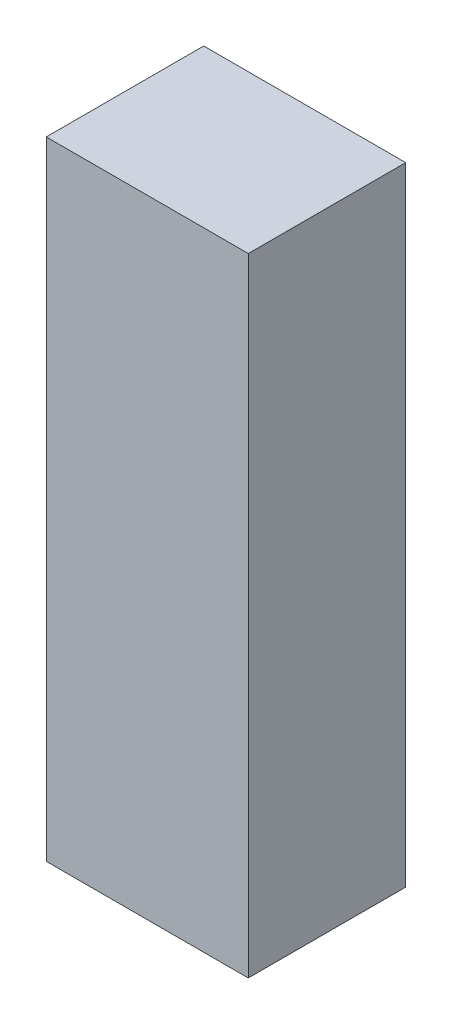
ISO-10303-21;
HEADER;
FILE_DESCRIPTION(('STEP AP214'),'2;1');
FILE_NAME('part.step','',(''),(''),'','','');
FILE_SCHEMA(('AUTOMOTIVE_DESIGN { 1 0 10303 214 1 1 1 1 }'));
ENDSEC;
DATA;
#1=APPLICATION_CONTEXT('core data for automotive mechanical design processes');
#2=APPLICATION_PROTOCOL_DEFINITION('international standard','automotive_design',2000,#1);
#3=PRODUCT_CONTEXT('',#1,'mechanical');
#4=PRODUCT('Part','Part','',(#3));
#5=PRODUCT_RELATED_PRODUCT_CATEGORY('part','',(#4));
#6=PRODUCT_DEFINITION_FORMATION('','',#4);
#7=PRODUCT_DEFINITION_CONTEXT('part definition',#1,'design');
#8=PRODUCT_DEFINITION('design','',#6,#7);
#9=PRODUCT_DEFINITION_SHAPE('','',#8);
#10=(LENGTH_UNIT() NAMED_UNIT(*) SI_UNIT(.MILLI.,.METRE.));
#11=(NAMED_UNIT(*) PLANE_ANGLE_UNIT() SI_UNIT($,.RADIAN.));
#12=(NAMED_UNIT(*) SI_UNIT($,.STERADIAN.) SOLID_ANGLE_UNIT());
#13=UNCERTAINTY_MEASURE_WITH_UNIT(LENGTH_MEASURE(1.E-05),#10,'distance_accuracy_value','');
#14=(GEOMETRIC_REPRESENTATION_CONTEXT(3) GLOBAL_UNCERTAINTY_ASSIGNED_CONTEXT((#13)) GLOBAL_UNIT_ASSIGNED_CONTEXT((#10,
#11,#12)) REPRESENTATION_CONTEXT('',''));
#15=CARTESIAN_POINT('',(0.,0.,0.));
#16=DIRECTION('',(0.,0.,1.));
#17=DIRECTION('',(1.,0.,0.));
#18=AXIS2_PLACEMENT_3D('',#15,#16,#17);
#19=CARTESIAN_POINT('',(-17.,52.8,26.5));
#20=DIRECTION('',(1.,0.,0.));
#21=DIRECTION('',(0.,1.,0.));
#22=AXIS2_PLACEMENT_3D('',#19,#20,#21);
#23=PLANE('',#22);
#24=DIRECTION('',(0.,-1.,0.));
#25=VECTOR('',#24,1.);
#26=CARTESIAN_POINT('',(-17.,52.8,0.));
#27=LINE('',#26,#25);
#28=CARTESIAN_POINT('',(-17.,52.8,0.));
#29=VERTEX_POINT('',#28);
#30=CARTESIAN_POINT('',(-17.,-52.8,0.));
#31=VERTEX_POINT('',#30);
#32=EDGE_CURVE('E97',#29,#31,#27,.T.);
#33=ORIENTED_EDGE('',*,*,#32,.T.);
#34=DIRECTION('',(0.,0.,-1.));
#35=VECTOR('',#34,1.);
#36=CARTESIAN_POINT('',(-17.,-52.8,26.5));
#37=LINE('',#36,#35);
#38=CARTESIAN_POINT('',(-17.,-52.8,26.5));
#39=VERTEX_POINT('',#38);
#40=EDGE_CURVE('E11',#39,#31,#37,.T.);
#41=ORIENTED_EDGE('',*,*,#40,.F.);
#42=DIRECTION('',(0.,-1.,0.));
#43=VECTOR('',#42,1.);
#44=CARTESIAN_POINT('',(-17.,52.8,26.5));
#45=LINE('',#44,#43);
#46=CARTESIAN_POINT('',(-17.,52.8,26.5));
#47=VERTEX_POINT('',#46);
#48=EDGE_CURVE('E85',#47,#39,#45,.T.);
#49=ORIENTED_EDGE('',*,*,#48,.F.);
#50=DIRECTION('',(0.,0.,-1.));
#51=VECTOR('',#50,1.);
#52=CARTESIAN_POINT('',(-17.,52.8,26.5));
#53=LINE('',#52,#51);
#54=EDGE_CURVE('E93',#47,#29,#53,.T.);
#55=ORIENTED_EDGE('',*,*,#54,.T.);
#56=EDGE_LOOP('',(#33,#41,#49,#55));
#57=FACE_BOUND('',#56,.T.);
#58=ADVANCED_FACE('F34',(#57),#23,.F.);
#59=CARTESIAN_POINT('',(17.,-52.8,26.5));
#60=DIRECTION('',(0.,1.,0.));
#61=DIRECTION('',(0.,0.,1.));
#62=AXIS2_PLACEMENT_3D('',#59,#60,#61);
#63=PLANE('',#62);
#64=DIRECTION('',(1.,0.,0.));
#65=VECTOR('',#64,1.);
#66=CARTESIAN_POINT('',(17.,-52.8,0.));
#67=LINE('',#66,#65);
#68=CARTESIAN_POINT('',(17.,-52.8,0.));
#69=VERTEX_POINT('',#68);
#70=EDGE_CURVE('E89',#31,#69,#67,.T.);
#71=ORIENTED_EDGE('',*,*,#70,.T.);
#72=DIRECTION('',(0.,0.,-1.));
#73=VECTOR('',#72,1.);
#74=CARTESIAN_POINT('',(17.,-52.8,26.5));
#75=LINE('',#74,#73);
#76=CARTESIAN_POINT('',(17.,-52.8,26.5));
#77=VERTEX_POINT('',#76);
#78=EDGE_CURVE('E42',#77,#69,#75,.T.);
#79=ORIENTED_EDGE('',*,*,#78,.F.);
#80=DIRECTION('',(1.,0.,0.));
#81=VECTOR('',#80,1.);
#82=CARTESIAN_POINT('',(17.,-52.8,26.5));
#83=LINE('',#82,#81);
#84=EDGE_CURVE('E80',#39,#77,#83,.T.);
#85=ORIENTED_EDGE('',*,*,#84,.F.);
#86=ORIENTED_EDGE('',*,*,#40,.T.);
#87=EDGE_LOOP('',(#71,#79,#85,#86));
#88=FACE_BOUND('',#87,.T.);
#89=ADVANCED_FACE('F88',(#88),#63,.F.);
#90=CARTESIAN_POINT('',(17.,52.8,26.5));
#91=DIRECTION('',(-1.,0.,0.));
#92=DIRECTION('',(0.,-1.,0.));
#93=AXIS2_PLACEMENT_3D('',#90,#91,#92);
#94=PLANE('',#93);
#95=DIRECTION('',(0.,1.,0.));
#96=VECTOR('',#95,1.);
#97=CARTESIAN_POINT('',(17.,52.8,0.));
#98=LINE('',#97,#96);
#99=CARTESIAN_POINT('',(17.,52.8,0.));
#100=VERTEX_POINT('',#99);
#101=EDGE_CURVE('E67',#69,#100,#98,.T.);
#102=ORIENTED_EDGE('',*,*,#101,.T.);
#103=DIRECTION('',(0.,0.,-1.));
#104=VECTOR('',#103,1.);
#105=CARTESIAN_POINT('',(17.,52.8,26.5));
#106=LINE('',#105,#104);
#107=CARTESIAN_POINT('',(17.,52.8,26.5));
#108=VERTEX_POINT('',#107);
#109=EDGE_CURVE('E90',#108,#100,#106,.T.);
#110=ORIENTED_EDGE('',*,*,#109,.F.);
#111=DIRECTION('',(0.,1.,0.));
#112=VECTOR('',#111,1.);
#113=CARTESIAN_POINT('',(17.,52.8,26.5));
#114=LINE('',#113,#112);
#115=EDGE_CURVE('E83',#77,#108,#114,.T.);
#116=ORIENTED_EDGE('',*,*,#115,.F.);
#117=ORIENTED_EDGE('',*,*,#78,.T.);
#118=EDGE_LOOP('',(#102,#110,#116,#117));
#119=FACE_BOUND('',#118,.T.);
#120=ADVANCED_FACE('F91',(#119),#94,.F.);
#121=CARTESIAN_POINT('',(17.,52.8,26.5));
#122=DIRECTION('',(0.,-1.,0.));
#123=DIRECTION('',(0.,0.,-1.));
#124=AXIS2_PLACEMENT_3D('',#121,#122,#123);
#125=PLANE('',#124);
#126=DIRECTION('',(-1.,0.,0.));
#127=VECTOR('',#126,1.);
#128=CARTESIAN_POINT('',(17.,52.8,0.));
#129=LINE('',#128,#127);
#130=EDGE_CURVE('E73',#100,#29,#129,.T.);
#131=ORIENTED_EDGE('',*,*,#130,.T.);
#132=ORIENTED_EDGE('',*,*,#54,.F.);
#133=DIRECTION('',(-1.,0.,0.));
#134=VECTOR('',#133,1.);
#135=CARTESIAN_POINT('',(17.,52.8,26.5));
#136=LINE('',#135,#134);
#137=EDGE_CURVE('E50',#108,#47,#136,.T.);
#138=ORIENTED_EDGE('',*,*,#137,.F.);
#139=ORIENTED_EDGE('',*,*,#109,.T.);
#140=EDGE_LOOP('',(#131,#132,#138,#139));
#141=FACE_BOUND('',#140,.T.);
#142=ADVANCED_FACE('F104',(#141),#125,.F.);
#143=CARTESIAN_POINT('',(0.,0.,26.5));
#144=DIRECTION('',(0.,0.,-1.));
#145=DIRECTION('',(-1.,0.,0.));
#146=AXIS2_PLACEMENT_3D('',#143,#144,#145);
#147=PLANE('',#146);
#148=ORIENTED_EDGE('',*,*,#48,.T.);
#149=ORIENTED_EDGE('',*,*,#84,.T.);
#150=ORIENTED_EDGE('',*,*,#115,.T.);
#151=ORIENTED_EDGE('',*,*,#137,.T.);
#152=EDGE_LOOP('',(#148,#149,#150,#151));
#153=FACE_BOUND('',#152,.T.);
#154=ADVANCED_FACE('F81',(#153),#147,.F.);
#155=CARTESIAN_POINT('',(0.,0.,0.));
#156=DIRECTION('',(0.,0.,-1.));
#157=DIRECTION('',(-1.,0.,0.));
#158=AXIS2_PLACEMENT_3D('',#155,#156,#157);
#159=PLANE('',#158);
#160=ORIENTED_EDGE('',*,*,#32,.F.);
#161=ORIENTED_EDGE('',*,*,#130,.F.);
#162=ORIENTED_EDGE('',*,*,#101,.F.);
#163=ORIENTED_EDGE('',*,*,#70,.F.);
#164=EDGE_LOOP('',(#160,#161,#162,#163));
#165=FACE_BOUND('',#164,.T.);
#166=ADVANCED_FACE('F107',(#165),#159,.T.);
#167=CLOSED_SHELL('',(#58,#89,#120,#142,#154,#166));
#168=MANIFOLD_SOLID_BREP('B2',#167);
#169=ADVANCED_BREP_SHAPE_REPRESENTATION('',(#18,#168),#14);
#170=SHAPE_DEFINITION_REPRESENTATION(#9,#169);
ENDSEC;
END-ISO-10303-21;
